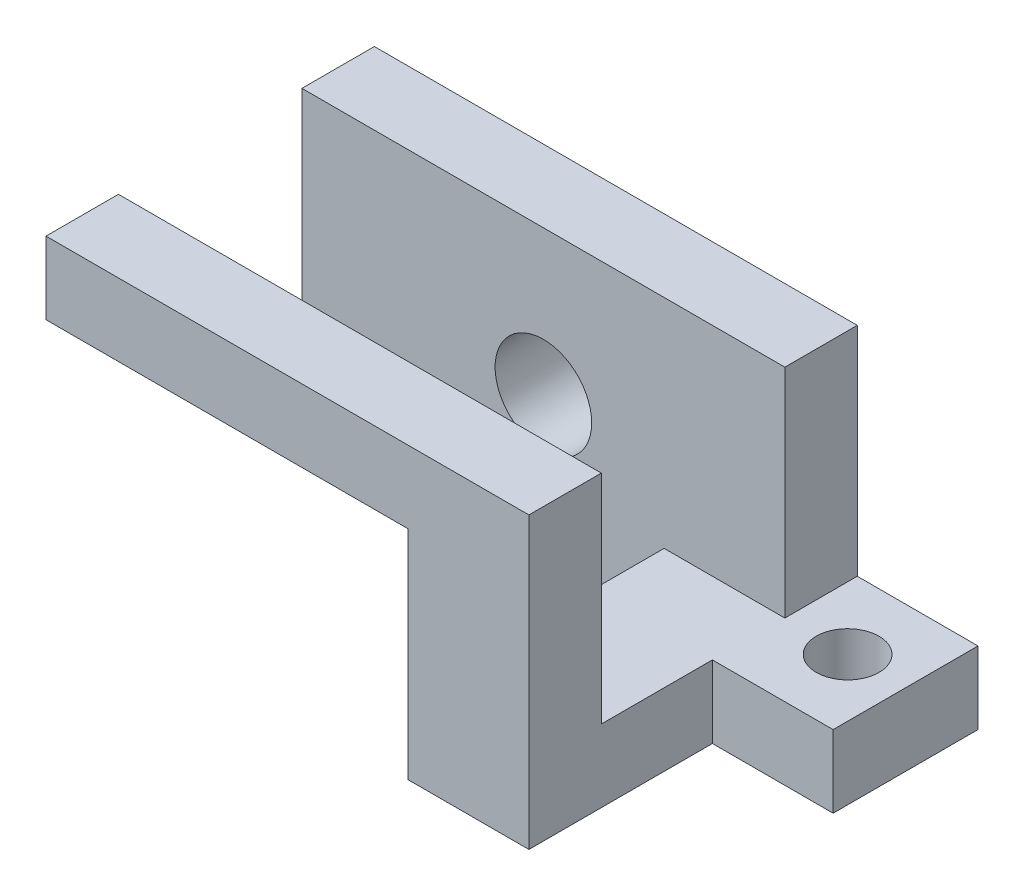
ISO-10303-21;
HEADER;
FILE_DESCRIPTION(('STEP AP214'),'2;1');
FILE_NAME('part.step','',(''),(''),'','','');
FILE_SCHEMA(('AUTOMOTIVE_DESIGN { 1 0 10303 214 1 1 1 1 }'));
ENDSEC;
DATA;
#1=APPLICATION_CONTEXT('core data for automotive mechanical design processes');
#2=APPLICATION_PROTOCOL_DEFINITION('international standard','automotive_design',2000,#1);
#3=PRODUCT_CONTEXT('',#1,'mechanical');
#4=PRODUCT('Part','Part','',(#3));
#5=PRODUCT_RELATED_PRODUCT_CATEGORY('part','',(#4));
#6=PRODUCT_DEFINITION_FORMATION('','',#4);
#7=PRODUCT_DEFINITION_CONTEXT('part definition',#1,'design');
#8=PRODUCT_DEFINITION('design','',#6,#7);
#9=PRODUCT_DEFINITION_SHAPE('','',#8);
#10=(LENGTH_UNIT() NAMED_UNIT(*) SI_UNIT(.MILLI.,.METRE.));
#11=(NAMED_UNIT(*) PLANE_ANGLE_UNIT() SI_UNIT($,.RADIAN.));
#12=(NAMED_UNIT(*) SI_UNIT($,.STERADIAN.) SOLID_ANGLE_UNIT());
#13=UNCERTAINTY_MEASURE_WITH_UNIT(LENGTH_MEASURE(1.E-05),#10,'distance_accuracy_value','');
#14=(GEOMETRIC_REPRESENTATION_CONTEXT(3) GLOBAL_UNCERTAINTY_ASSIGNED_CONTEXT((#13)) GLOBAL_UNIT_ASSIGNED_CONTEXT((#10,
#11,#12)) REPRESENTATION_CONTEXT('',''));
#15=CARTESIAN_POINT('',(0.,0.,0.));
#16=DIRECTION('',(0.,0.,1.));
#17=DIRECTION('',(1.,0.,0.));
#18=AXIS2_PLACEMENT_3D('',#15,#16,#17);
#19=CARTESIAN_POINT('',(-50.,0.,15.));
#20=DIRECTION('',(-1.,0.,0.));
#21=DIRECTION('',(0.,0.,1.));
#22=AXIS2_PLACEMENT_3D('',#19,#20,#21);
#23=PLANE('',#22);
#24=DIRECTION('',(0.,1.,0.));
#25=VECTOR('',#24,1.);
#26=CARTESIAN_POINT('',(-50.,0.,0.));
#27=LINE('',#26,#25);
#28=CARTESIAN_POINT('',(-50.,-30.,0.));
#29=VERTEX_POINT('',#28);
#30=CARTESIAN_POINT('',(-50.,30.,0.));
#31=VERTEX_POINT('',#30);
#32=EDGE_CURVE('E142',#29,#31,#27,.T.);
#33=ORIENTED_EDGE('',*,*,#32,.F.);
#34=DIRECTION('',(0.,0.,-1.));
#35=VECTOR('',#34,1.);
#36=CARTESIAN_POINT('',(-50.,-30.,15.));
#37=LINE('',#36,#35);
#38=CARTESIAN_POINT('',(-50.,-30.,15.));
#39=VERTEX_POINT('',#38);
#40=EDGE_CURVE('E49',#39,#29,#37,.T.);
#41=ORIENTED_EDGE('',*,*,#40,.F.);
#42=DIRECTION('',(0.,1.,0.));
#43=VECTOR('',#42,1.);
#44=CARTESIAN_POINT('',(-50.,0.,15.));
#45=LINE('',#44,#43);
#46=CARTESIAN_POINT('',(-50.,30.,15.));
#47=VERTEX_POINT('',#46);
#48=EDGE_CURVE('E134',#39,#47,#45,.T.);
#49=ORIENTED_EDGE('',*,*,#48,.T.);
#50=DIRECTION('',(0.,0.,-1.));
#51=VECTOR('',#50,1.);
#52=CARTESIAN_POINT('',(-50.,30.,15.));
#53=LINE('',#52,#51);
#54=EDGE_CURVE('E61',#47,#31,#53,.T.);
#55=ORIENTED_EDGE('',*,*,#54,.T.);
#56=EDGE_LOOP('',(#33,#41,#49,#55));
#57=FACE_BOUND('',#56,.T.);
#58=ADVANCED_FACE('F43',(#57),#23,.T.);
#59=CARTESIAN_POINT('',(0.,-30.,15.));
#60=DIRECTION('',(0.,1.,0.));
#61=DIRECTION('',(-1.,0.,0.));
#62=AXIS2_PLACEMENT_3D('',#59,#60,#61);
#63=PLANE('',#62);
#64=CARTESIAN_POINT('',(63.,-30.,15.));
#65=DIRECTION('',(0.,1.,0.));
#66=DIRECTION('',(-1.,0.,0.));
#67=AXIS2_PLACEMENT_3D('',#64,#65,#66);
#68=CIRCLE('',#67,6.5);
#69=CARTESIAN_POINT('',(56.5,-30.,15.));
#70=VERTEX_POINT('',#69);
#71=EDGE_CURVE('E209',#70,#70,#68,.T.);
#72=ORIENTED_EDGE('',*,*,#71,.T.);
#73=EDGE_LOOP('',(#72));
#74=FACE_BOUND('',#73,.T.);
#75=DIRECTION('',(1.,0.,0.));
#76=VECTOR('',#75,1.);
#77=CARTESIAN_POINT('',(0.,-30.,30.));
#78=LINE('',#77,#76);
#79=CARTESIAN_POINT('',(50.,-30.,30.));
#80=VERTEX_POINT('',#79);
#81=CARTESIAN_POINT('',(75.,-30.,30.));
#82=VERTEX_POINT('',#81);
#83=EDGE_CURVE('E162',#80,#82,#78,.T.);
#84=ORIENTED_EDGE('',*,*,#83,.F.);
#85=DIRECTION('',(0.,0.,-1.));
#86=VECTOR('',#85,1.);
#87=CARTESIAN_POINT('',(50.,-30.,53.));
#88=LINE('',#87,#86);
#89=CARTESIAN_POINT('',(50.,-30.,68.));
#90=VERTEX_POINT('',#89);
#91=EDGE_CURVE('E173',#90,#80,#88,.T.);
#92=ORIENTED_EDGE('',*,*,#91,.F.);
#93=DIRECTION('',(1.,0.,0.));
#94=VECTOR('',#93,1.);
#95=CARTESIAN_POINT('',(25.,-30.,68.));
#96=LINE('',#95,#94);
#97=CARTESIAN_POINT('',(25.,-30.,68.));
#98=VERTEX_POINT('',#97);
#99=EDGE_CURVE('E197',#98,#90,#96,.T.);
#100=ORIENTED_EDGE('',*,*,#99,.F.);
#101=DIRECTION('',(0.,0.,-1.));
#102=VECTOR('',#101,1.);
#103=CARTESIAN_POINT('',(25.,-30.,30.));
#104=LINE('',#103,#102);
#105=CARTESIAN_POINT('',(25.,-30.,15.));
#106=VERTEX_POINT('',#105);
#107=EDGE_CURVE('E158',#98,#106,#104,.T.);
#108=ORIENTED_EDGE('',*,*,#107,.T.);
#109=DIRECTION('',(1.,0.,0.));
#110=VECTOR('',#109,1.);
#111=CARTESIAN_POINT('',(0.,-30.,15.));
#112=LINE('',#111,#110);
#113=EDGE_CURVE('E149',#39,#106,#112,.T.);
#114=ORIENTED_EDGE('',*,*,#113,.F.);
#115=ORIENTED_EDGE('',*,*,#40,.T.);
#116=DIRECTION('',(1.,0.,0.));
#117=VECTOR('',#116,1.);
#118=CARTESIAN_POINT('',(0.,-30.,0.));
#119=LINE('',#118,#117);
#120=CARTESIAN_POINT('',(75.,-30.,0.));
#121=VERTEX_POINT('',#120);
#122=EDGE_CURVE('E139',#29,#121,#119,.T.);
#123=ORIENTED_EDGE('',*,*,#122,.T.);
#124=DIRECTION('',(0.,0.,-1.));
#125=VECTOR('',#124,1.);
#126=CARTESIAN_POINT('',(75.,-30.,30.));
#127=LINE('',#126,#125);
#128=EDGE_CURVE('E145',#82,#121,#127,.T.);
#129=ORIENTED_EDGE('',*,*,#128,.F.);
#130=EDGE_LOOP('',(#84,#92,#100,#108,#114,#115,#123,#129));
#131=FACE_BOUND('',#130,.T.);
#132=ADVANCED_FACE('F233',(#74,#131),#63,.F.);
#133=CARTESIAN_POINT('',(50.,0.,15.));
#134=DIRECTION('',(-1.,0.,0.));
#135=DIRECTION('',(0.,0.,1.));
#136=AXIS2_PLACEMENT_3D('',#133,#134,#135);
#137=PLANE('',#136);
#138=DIRECTION('',(0.,1.,0.));
#139=VECTOR('',#138,1.);
#140=CARTESIAN_POINT('',(50.,0.,0.));
#141=LINE('',#140,#139);
#142=CARTESIAN_POINT('',(50.,-15.,0.));
#143=VERTEX_POINT('',#142);
#144=CARTESIAN_POINT('',(50.,30.,0.));
#145=VERTEX_POINT('',#144);
#146=EDGE_CURVE('E140',#143,#145,#141,.T.);
#147=ORIENTED_EDGE('',*,*,#146,.T.);
#148=DIRECTION('',(0.,0.,-1.));
#149=VECTOR('',#148,1.);
#150=CARTESIAN_POINT('',(50.,30.,15.));
#151=LINE('',#150,#149);
#152=CARTESIAN_POINT('',(50.,30.,15.));
#153=VERTEX_POINT('',#152);
#154=EDGE_CURVE('E103',#153,#145,#151,.T.);
#155=ORIENTED_EDGE('',*,*,#154,.F.);
#156=DIRECTION('',(0.,1.,0.));
#157=VECTOR('',#156,1.);
#158=CARTESIAN_POINT('',(50.,0.,15.));
#159=LINE('',#158,#157);
#160=CARTESIAN_POINT('',(50.,-15.,15.));
#161=VERTEX_POINT('',#160);
#162=EDGE_CURVE('E96',#161,#153,#159,.T.);
#163=ORIENTED_EDGE('',*,*,#162,.F.);
#164=DIRECTION('',(0.,0.,-1.));
#165=VECTOR('',#164,1.);
#166=CARTESIAN_POINT('',(50.,-15.,15.));
#167=LINE('',#166,#165);
#168=EDGE_CURVE('E101',#161,#143,#167,.T.);
#169=ORIENTED_EDGE('',*,*,#168,.T.);
#170=EDGE_LOOP('',(#147,#155,#163,#169));
#171=FACE_BOUND('',#170,.T.);
#172=ADVANCED_FACE('F97',(#171),#137,.F.);
#173=CARTESIAN_POINT('',(0.,30.,15.));
#174=DIRECTION('',(0.,1.,0.));
#175=DIRECTION('',(0.,0.,1.));
#176=AXIS2_PLACEMENT_3D('',#173,#174,#175);
#177=PLANE('',#176);
#178=DIRECTION('',(1.,0.,0.));
#179=VECTOR('',#178,1.);
#180=CARTESIAN_POINT('',(0.,30.,0.));
#181=LINE('',#180,#179);
#182=EDGE_CURVE('E131',#31,#145,#181,.T.);
#183=ORIENTED_EDGE('',*,*,#182,.F.);
#184=ORIENTED_EDGE('',*,*,#54,.F.);
#185=DIRECTION('',(1.,0.,0.));
#186=VECTOR('',#185,1.);
#187=CARTESIAN_POINT('',(0.,30.,15.));
#188=LINE('',#187,#186);
#189=EDGE_CURVE('E106',#47,#153,#188,.T.);
#190=ORIENTED_EDGE('',*,*,#189,.T.);
#191=ORIENTED_EDGE('',*,*,#154,.T.);
#192=EDGE_LOOP('',(#183,#184,#190,#191));
#193=FACE_BOUND('',#192,.T.);
#194=ADVANCED_FACE('F266',(#193),#177,.T.);
#195=CARTESIAN_POINT('',(0.,0.,15.));
#196=DIRECTION('',(0.,0.,-1.));
#197=DIRECTION('',(-1.,0.,0.));
#198=AXIS2_PLACEMENT_3D('',#195,#196,#197);
#199=CYLINDRICAL_SURFACE('',#198,10.);
#200=CARTESIAN_POINT('',(0.,0.,15.));
#201=DIRECTION('',(0.,0.,1.));
#202=DIRECTION('',(1.,0.,0.));
#203=AXIS2_PLACEMENT_3D('',#200,#201,#202);
#204=CIRCLE('',#203,10.);
#205=CARTESIAN_POINT('',(10.,0.,15.));
#206=VERTEX_POINT('',#205);
#207=EDGE_CURVE('E129',#206,#206,#204,.T.);
#208=ORIENTED_EDGE('',*,*,#207,.T.);
#209=EDGE_LOOP('',(#208));
#210=FACE_BOUND('',#209,.T.);
#211=CARTESIAN_POINT('',(0.,0.,0.));
#212=DIRECTION('',(0.,0.,1.));
#213=DIRECTION('',(1.,0.,0.));
#214=AXIS2_PLACEMENT_3D('',#211,#212,#213);
#215=CIRCLE('',#214,10.);
#216=CARTESIAN_POINT('',(10.,0.,0.));
#217=VERTEX_POINT('',#216);
#218=EDGE_CURVE('E128',#217,#217,#215,.T.);
#219=ORIENTED_EDGE('',*,*,#218,.F.);
#220=EDGE_LOOP('',(#219));
#221=FACE_BOUND('',#220,.T.);
#222=ADVANCED_FACE('F475',(#210,#221),#199,.F.);
#223=CARTESIAN_POINT('',(0.,0.,15.));
#224=DIRECTION('',(0.,0.,1.));
#225=DIRECTION('',(1.,0.,0.));
#226=AXIS2_PLACEMENT_3D('',#223,#224,#225);
#227=PLANE('',#226);
#228=ORIENTED_EDGE('',*,*,#48,.F.);
#229=ORIENTED_EDGE('',*,*,#113,.T.);
#230=DIRECTION('',(0.,-1.,0.));
#231=VECTOR('',#230,1.);
#232=CARTESIAN_POINT('',(25.,0.,15.));
#233=LINE('',#232,#231);
#234=CARTESIAN_POINT('',(25.,-15.,15.));
#235=VERTEX_POINT('',#234);
#236=EDGE_CURVE('E113',#235,#106,#233,.T.);
#237=ORIENTED_EDGE('',*,*,#236,.F.);
#238=DIRECTION('',(-1.,0.,0.));
#239=VECTOR('',#238,1.);
#240=CARTESIAN_POINT('',(0.,-15.,15.));
#241=LINE('',#240,#239);
#242=EDGE_CURVE('E110',#161,#235,#241,.T.);
#243=ORIENTED_EDGE('',*,*,#242,.F.);
#244=ORIENTED_EDGE('',*,*,#162,.T.);
#245=ORIENTED_EDGE('',*,*,#189,.F.);
#246=EDGE_LOOP('',(#228,#229,#237,#243,#244,#245));
#247=FACE_BOUND('',#246,.T.);
#248=ORIENTED_EDGE('',*,*,#207,.F.);
#249=EDGE_LOOP('',(#248));
#250=FACE_BOUND('',#249,.T.);
#251=ADVANCED_FACE('F112',(#247,#250),#227,.T.);
#252=CARTESIAN_POINT('',(0.,0.,0.));
#253=DIRECTION('',(0.,0.,1.));
#254=DIRECTION('',(1.,0.,0.));
#255=AXIS2_PLACEMENT_3D('',#252,#253,#254);
#256=PLANE('',#255);
#257=DIRECTION('',(0.,1.,0.));
#258=VECTOR('',#257,1.);
#259=CARTESIAN_POINT('',(75.,0.,0.));
#260=LINE('',#259,#258);
#261=CARTESIAN_POINT('',(75.,-15.,0.));
#262=VERTEX_POINT('',#261);
#263=EDGE_CURVE('E163',#121,#262,#260,.T.);
#264=ORIENTED_EDGE('',*,*,#263,.F.);
#265=ORIENTED_EDGE('',*,*,#122,.F.);
#266=ORIENTED_EDGE('',*,*,#32,.T.);
#267=ORIENTED_EDGE('',*,*,#182,.T.);
#268=ORIENTED_EDGE('',*,*,#146,.F.);
#269=DIRECTION('',(-1.,0.,0.));
#270=VECTOR('',#269,1.);
#271=CARTESIAN_POINT('',(0.,-15.,0.));
#272=LINE('',#271,#270);
#273=EDGE_CURVE('E124',#262,#143,#272,.T.);
#274=ORIENTED_EDGE('',*,*,#273,.F.);
#275=EDGE_LOOP('',(#264,#265,#266,#267,#268,#274));
#276=FACE_BOUND('',#275,.T.);
#277=ORIENTED_EDGE('',*,*,#218,.T.);
#278=EDGE_LOOP('',(#277));
#279=FACE_BOUND('',#278,.T.);
#280=ADVANCED_FACE('F254',(#276,#279),#256,.F.);
#281=CARTESIAN_POINT('',(75.,0.,30.));
#282=DIRECTION('',(-1.,0.,0.));
#283=DIRECTION('',(0.,0.,1.));
#284=AXIS2_PLACEMENT_3D('',#281,#282,#283);
#285=PLANE('',#284);
#286=ORIENTED_EDGE('',*,*,#263,.T.);
#287=DIRECTION('',(0.,0.,-1.));
#288=VECTOR('',#287,1.);
#289=CARTESIAN_POINT('',(75.,-15.,30.));
#290=LINE('',#289,#288);
#291=CARTESIAN_POINT('',(75.,-15.,30.));
#292=VERTEX_POINT('',#291);
#293=EDGE_CURVE('E152',#292,#262,#290,.T.);
#294=ORIENTED_EDGE('',*,*,#293,.F.);
#295=DIRECTION('',(0.,1.,0.));
#296=VECTOR('',#295,1.);
#297=CARTESIAN_POINT('',(75.,0.,30.));
#298=LINE('',#297,#296);
#299=EDGE_CURVE('E166',#82,#292,#298,.T.);
#300=ORIENTED_EDGE('',*,*,#299,.F.);
#301=ORIENTED_EDGE('',*,*,#128,.T.);
#302=EDGE_LOOP('',(#286,#294,#300,#301));
#303=FACE_BOUND('',#302,.T.);
#304=ADVANCED_FACE('F243',(#303),#285,.F.);
#305=CARTESIAN_POINT('',(0.,-15.,30.));
#306=DIRECTION('',(0.,-1.,0.));
#307=DIRECTION('',(1.,0.,0.));
#308=AXIS2_PLACEMENT_3D('',#305,#306,#307);
#309=PLANE('',#308);
#310=CARTESIAN_POINT('',(63.,-15.,15.));
#311=DIRECTION('',(0.,1.,0.));
#312=DIRECTION('',(-1.,0.,0.));
#313=AXIS2_PLACEMENT_3D('',#310,#311,#312);
#314=CIRCLE('',#313,6.5);
#315=CARTESIAN_POINT('',(56.5,-15.,15.));
#316=VERTEX_POINT('',#315);
#317=EDGE_CURVE('E230',#316,#316,#314,.T.);
#318=ORIENTED_EDGE('',*,*,#317,.F.);
#319=EDGE_LOOP('',(#318));
#320=FACE_BOUND('',#319,.T.);
#321=DIRECTION('',(0.,0.,-1.));
#322=VECTOR('',#321,1.);
#323=CARTESIAN_POINT('',(25.,-15.,30.));
#324=LINE('',#323,#322);
#325=CARTESIAN_POINT('',(25.,-15.,53.));
#326=VERTEX_POINT('',#325);
#327=EDGE_CURVE('E156',#326,#235,#324,.T.);
#328=ORIENTED_EDGE('',*,*,#327,.F.);
#329=DIRECTION('',(-1.,0.,0.));
#330=VECTOR('',#329,1.);
#331=CARTESIAN_POINT('',(0.,-15.,53.));
#332=LINE('',#331,#330);
#333=CARTESIAN_POINT('',(50.,-15.,53.));
#334=VERTEX_POINT('',#333);
#335=EDGE_CURVE('E178',#334,#326,#332,.T.);
#336=ORIENTED_EDGE('',*,*,#335,.F.);
#337=DIRECTION('',(0.,0.,-1.));
#338=VECTOR('',#337,1.);
#339=CARTESIAN_POINT('',(50.,-15.,53.));
#340=LINE('',#339,#338);
#341=CARTESIAN_POINT('',(50.,-15.,30.));
#342=VERTEX_POINT('',#341);
#343=EDGE_CURVE('E170',#334,#342,#340,.T.);
#344=ORIENTED_EDGE('',*,*,#343,.T.);
#345=DIRECTION('',(-1.,0.,0.));
#346=VECTOR('',#345,1.);
#347=CARTESIAN_POINT('',(0.,-15.,30.));
#348=LINE('',#347,#346);
#349=EDGE_CURVE('E161',#292,#342,#348,.T.);
#350=ORIENTED_EDGE('',*,*,#349,.F.);
#351=ORIENTED_EDGE('',*,*,#293,.T.);
#352=ORIENTED_EDGE('',*,*,#273,.T.);
#353=ORIENTED_EDGE('',*,*,#168,.F.);
#354=ORIENTED_EDGE('',*,*,#242,.T.);
#355=EDGE_LOOP('',(#328,#336,#344,#350,#351,#352,#353,#354));
#356=FACE_BOUND('',#355,.T.);
#357=ADVANCED_FACE('F122',(#320,#356),#309,.F.);
#358=CARTESIAN_POINT('',(25.,0.,30.));
#359=DIRECTION('',(1.,0.,0.));
#360=DIRECTION('',(0.,1.,0.));
#361=AXIS2_PLACEMENT_3D('',#358,#359,#360);
#362=PLANE('',#361);
#363=ORIENTED_EDGE('',*,*,#236,.T.);
#364=ORIENTED_EDGE('',*,*,#107,.F.);
#365=DIRECTION('',(0.,-1.,0.));
#366=VECTOR('',#365,1.);
#367=CARTESIAN_POINT('',(25.,15.,68.));
#368=LINE('',#367,#366);
#369=CARTESIAN_POINT('',(25.,15.,68.));
#370=VERTEX_POINT('',#369);
#371=EDGE_CURVE('E193',#370,#98,#368,.T.);
#372=ORIENTED_EDGE('',*,*,#371,.F.);
#373=DIRECTION('',(0.,0.,-1.));
#374=VECTOR('',#373,1.);
#375=CARTESIAN_POINT('',(25.,15.,68.));
#376=LINE('',#375,#374);
#377=CARTESIAN_POINT('',(25.,15.,53.));
#378=VERTEX_POINT('',#377);
#379=EDGE_CURVE('E188',#370,#378,#376,.T.);
#380=ORIENTED_EDGE('',*,*,#379,.T.);
#381=DIRECTION('',(0.,-1.,0.));
#382=VECTOR('',#381,1.);
#383=CARTESIAN_POINT('',(25.,15.,53.));
#384=LINE('',#383,#382);
#385=EDGE_CURVE('E194',#378,#326,#384,.T.);
#386=ORIENTED_EDGE('',*,*,#385,.T.);
#387=ORIENTED_EDGE('',*,*,#327,.T.);
#388=EDGE_LOOP('',(#363,#364,#372,#380,#386,#387));
#389=FACE_BOUND('',#388,.T.);
#390=ADVANCED_FACE('F241',(#389),#362,.F.);
#391=CARTESIAN_POINT('',(0.,0.,30.));
#392=DIRECTION('',(0.,0.,1.));
#393=DIRECTION('',(1.,0.,0.));
#394=AXIS2_PLACEMENT_3D('',#391,#392,#393);
#395=PLANE('',#394);
#396=DIRECTION('',(0.,1.,0.));
#397=VECTOR('',#396,1.);
#398=CARTESIAN_POINT('',(50.,0.,30.));
#399=LINE('',#398,#397);
#400=EDGE_CURVE('E11',#80,#342,#399,.T.);
#401=ORIENTED_EDGE('',*,*,#400,.F.);
#402=ORIENTED_EDGE('',*,*,#83,.T.);
#403=ORIENTED_EDGE('',*,*,#299,.T.);
#404=ORIENTED_EDGE('',*,*,#349,.T.);
#405=EDGE_LOOP('',(#401,#402,#403,#404));
#406=FACE_BOUND('',#405,.T.);
#407=ADVANCED_FACE('F253',(#406),#395,.T.);
#408=CARTESIAN_POINT('',(50.,0.,53.));
#409=DIRECTION('',(1.,0.,0.));
#410=DIRECTION('',(0.,1.,0.));
#411=AXIS2_PLACEMENT_3D('',#408,#409,#410);
#412=PLANE('',#411);
#413=ORIENTED_EDGE('',*,*,#91,.T.);
#414=ORIENTED_EDGE('',*,*,#400,.T.);
#415=ORIENTED_EDGE('',*,*,#343,.F.);
#416=DIRECTION('',(0.,1.,0.));
#417=VECTOR('',#416,1.);
#418=CARTESIAN_POINT('',(50.,-30.,53.));
#419=LINE('',#418,#417);
#420=CARTESIAN_POINT('',(50.,30.,53.));
#421=VERTEX_POINT('',#420);
#422=EDGE_CURVE('E210',#334,#421,#419,.T.);
#423=ORIENTED_EDGE('',*,*,#422,.T.);
#424=DIRECTION('',(0.,0.,-1.));
#425=VECTOR('',#424,1.);
#426=CARTESIAN_POINT('',(50.,30.,68.));
#427=LINE('',#426,#425);
#428=CARTESIAN_POINT('',(50.,30.,68.));
#429=VERTEX_POINT('',#428);
#430=EDGE_CURVE('E182',#429,#421,#427,.T.);
#431=ORIENTED_EDGE('',*,*,#430,.F.);
#432=DIRECTION('',(0.,1.,0.));
#433=VECTOR('',#432,1.);
#434=CARTESIAN_POINT('',(50.,-30.,68.));
#435=LINE('',#434,#433);
#436=EDGE_CURVE('E225',#90,#429,#435,.T.);
#437=ORIENTED_EDGE('',*,*,#436,.F.);
#438=EDGE_LOOP('',(#413,#414,#415,#423,#431,#437));
#439=FACE_BOUND('',#438,.T.);
#440=ADVANCED_FACE('F310',(#439),#412,.T.);
#441=CARTESIAN_POINT('',(0.,0.,53.));
#442=DIRECTION('',(0.,0.,1.));
#443=DIRECTION('',(1.,0.,0.));
#444=AXIS2_PLACEMENT_3D('',#441,#442,#443);
#445=PLANE('',#444);
#446=ORIENTED_EDGE('',*,*,#422,.F.);
#447=ORIENTED_EDGE('',*,*,#335,.T.);
#448=ORIENTED_EDGE('',*,*,#385,.F.);
#449=DIRECTION('',(1.,0.,0.));
#450=VECTOR('',#449,1.);
#451=CARTESIAN_POINT('',(-50.,15.,53.));
#452=LINE('',#451,#450);
#453=CARTESIAN_POINT('',(-50.,15.,53.));
#454=VERTEX_POINT('',#453);
#455=EDGE_CURVE('E196',#454,#378,#452,.T.);
#456=ORIENTED_EDGE('',*,*,#455,.F.);
#457=DIRECTION('',(0.,-1.,0.));
#458=VECTOR('',#457,1.);
#459=CARTESIAN_POINT('',(-50.,30.,53.));
#460=LINE('',#459,#458);
#461=CARTESIAN_POINT('',(-50.,30.,53.));
#462=VERTEX_POINT('',#461);
#463=EDGE_CURVE('E203',#462,#454,#460,.T.);
#464=ORIENTED_EDGE('',*,*,#463,.F.);
#465=DIRECTION('',(-1.,0.,0.));
#466=VECTOR('',#465,1.);
#467=CARTESIAN_POINT('',(50.,30.,53.));
#468=LINE('',#467,#466);
#469=EDGE_CURVE('E204',#421,#462,#468,.T.);
#470=ORIENTED_EDGE('',*,*,#469,.F.);
#471=EDGE_LOOP('',(#446,#447,#448,#456,#464,#470));
#472=FACE_BOUND('',#471,.T.);
#473=ADVANCED_FACE('F325',(#472),#445,.F.);
#474=CARTESIAN_POINT('',(50.,30.,68.));
#475=DIRECTION('',(0.,-1.,0.));
#476=DIRECTION('',(0.,0.,-1.));
#477=AXIS2_PLACEMENT_3D('',#474,#475,#476);
#478=PLANE('',#477);
#479=ORIENTED_EDGE('',*,*,#469,.T.);
#480=DIRECTION('',(0.,0.,-1.));
#481=VECTOR('',#480,1.);
#482=CARTESIAN_POINT('',(-50.,30.,68.));
#483=LINE('',#482,#481);
#484=CARTESIAN_POINT('',(-50.,30.,68.));
#485=VERTEX_POINT('',#484);
#486=EDGE_CURVE('E184',#485,#462,#483,.T.);
#487=ORIENTED_EDGE('',*,*,#486,.F.);
#488=DIRECTION('',(-1.,0.,0.));
#489=VECTOR('',#488,1.);
#490=CARTESIAN_POINT('',(50.,30.,68.));
#491=LINE('',#490,#489);
#492=EDGE_CURVE('E218',#429,#485,#491,.T.);
#493=ORIENTED_EDGE('',*,*,#492,.F.);
#494=ORIENTED_EDGE('',*,*,#430,.T.);
#495=EDGE_LOOP('',(#479,#487,#493,#494));
#496=FACE_BOUND('',#495,.T.);
#497=ADVANCED_FACE('F324',(#496),#478,.F.);
#498=CARTESIAN_POINT('',(-50.,30.,68.));
#499=DIRECTION('',(1.,0.,0.));
#500=DIRECTION('',(0.,0.,-1.));
#501=AXIS2_PLACEMENT_3D('',#498,#499,#500);
#502=PLANE('',#501);
#503=ORIENTED_EDGE('',*,*,#463,.T.);
#504=DIRECTION('',(0.,0.,-1.));
#505=VECTOR('',#504,1.);
#506=CARTESIAN_POINT('',(-50.,15.,68.));
#507=LINE('',#506,#505);
#508=CARTESIAN_POINT('',(-50.,15.,68.));
#509=VERTEX_POINT('',#508);
#510=EDGE_CURVE('E190',#509,#454,#507,.T.);
#511=ORIENTED_EDGE('',*,*,#510,.F.);
#512=DIRECTION('',(0.,-1.,0.));
#513=VECTOR('',#512,1.);
#514=CARTESIAN_POINT('',(-50.,30.,68.));
#515=LINE('',#514,#513);
#516=EDGE_CURVE('E216',#485,#509,#515,.T.);
#517=ORIENTED_EDGE('',*,*,#516,.F.);
#518=ORIENTED_EDGE('',*,*,#486,.T.);
#519=EDGE_LOOP('',(#503,#511,#517,#518));
#520=FACE_BOUND('',#519,.T.);
#521=ADVANCED_FACE('F329',(#520),#502,.F.);
#522=CARTESIAN_POINT('',(-50.,15.,68.));
#523=DIRECTION('',(0.,1.,0.));
#524=DIRECTION('',(0.,0.,1.));
#525=AXIS2_PLACEMENT_3D('',#522,#523,#524);
#526=PLANE('',#525);
#527=ORIENTED_EDGE('',*,*,#455,.T.);
#528=ORIENTED_EDGE('',*,*,#379,.F.);
#529=DIRECTION('',(1.,0.,0.));
#530=VECTOR('',#529,1.);
#531=CARTESIAN_POINT('',(-50.,15.,68.));
#532=LINE('',#531,#530);
#533=EDGE_CURVE('E213',#509,#370,#532,.T.);
#534=ORIENTED_EDGE('',*,*,#533,.F.);
#535=ORIENTED_EDGE('',*,*,#510,.T.);
#536=EDGE_LOOP('',(#527,#528,#534,#535));
#537=FACE_BOUND('',#536,.T.);
#538=ADVANCED_FACE('F334',(#537),#526,.F.);
#539=CARTESIAN_POINT('',(0.,0.,68.));
#540=DIRECTION('',(0.,0.,1.));
#541=DIRECTION('',(1.,0.,0.));
#542=AXIS2_PLACEMENT_3D('',#539,#540,#541);
#543=PLANE('',#542);
#544=ORIENTED_EDGE('',*,*,#99,.T.);
#545=ORIENTED_EDGE('',*,*,#436,.T.);
#546=ORIENTED_EDGE('',*,*,#492,.T.);
#547=ORIENTED_EDGE('',*,*,#516,.T.);
#548=ORIENTED_EDGE('',*,*,#533,.T.);
#549=ORIENTED_EDGE('',*,*,#371,.T.);
#550=EDGE_LOOP('',(#544,#545,#546,#547,#548,#549));
#551=FACE_BOUND('',#550,.T.);
#552=ADVANCED_FACE('F239',(#551),#543,.T.);
#553=CARTESIAN_POINT('',(63.,-30.,15.));
#554=DIRECTION('',(0.,1.,0.));
#555=DIRECTION('',(-1.,0.,0.));
#556=AXIS2_PLACEMENT_3D('',#553,#554,#555);
#557=CYLINDRICAL_SURFACE('',#556,6.5);
#558=ORIENTED_EDGE('',*,*,#71,.F.);
#559=EDGE_LOOP('',(#558));
#560=FACE_BOUND('',#559,.T.);
#561=ORIENTED_EDGE('',*,*,#317,.T.);
#562=EDGE_LOOP('',(#561));
#563=FACE_BOUND('',#562,.T.);
#564=ADVANCED_FACE('F237',(#560,#563),#557,.F.);
#565=CLOSED_SHELL('',(#58,#132,#172,#194,#222,#251,#280,#304,#357,#390,#407,#440,#473,#497,#521,
#538,#552,#564));
#566=MANIFOLD_SOLID_BREP('B2',#565);
#567=ADVANCED_BREP_SHAPE_REPRESENTATION('',(#18,#566),#14);
#568=SHAPE_DEFINITION_REPRESENTATION(#9,#567);
ENDSEC;
END-ISO-10303-21;
